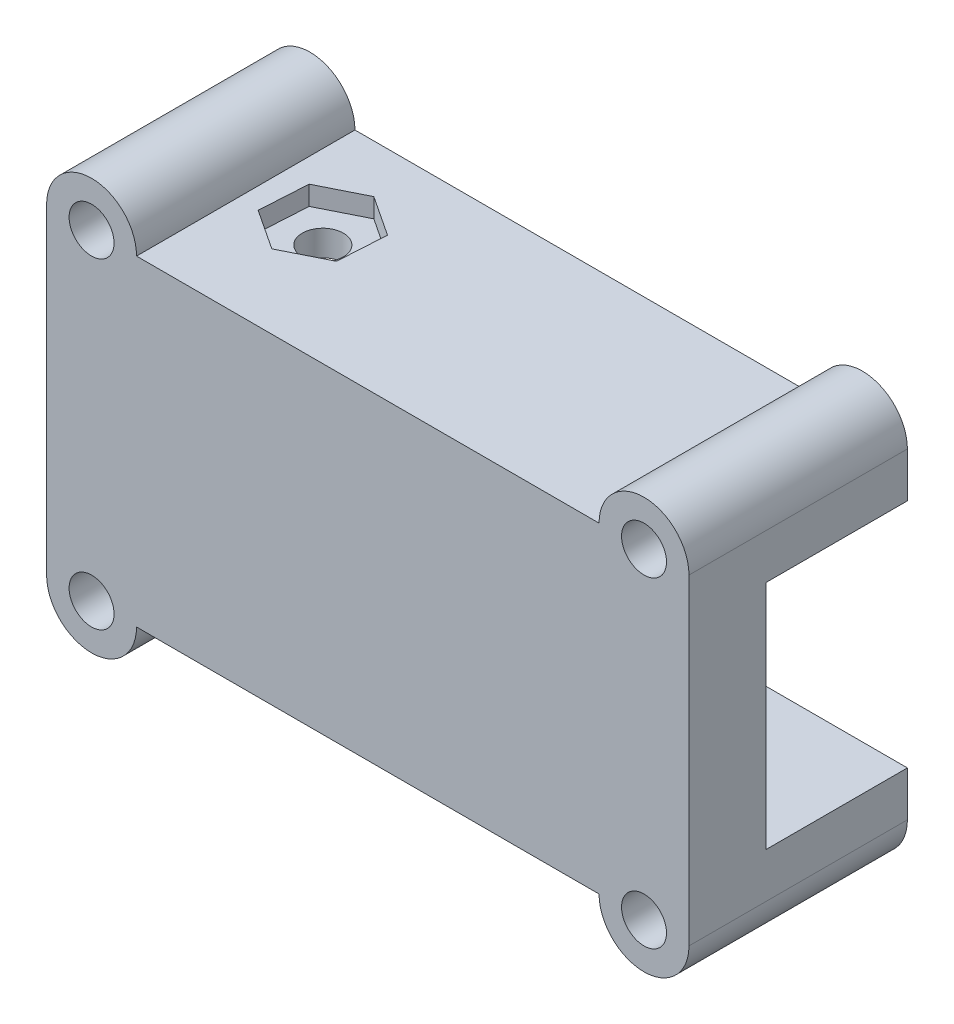
ISO-10303-21;
HEADER;
FILE_DESCRIPTION(('STEP AP214'),'2;1');
FILE_NAME('part.step','',(''),(''),'','','');
FILE_SCHEMA(('AUTOMOTIVE_DESIGN { 1 0 10303 214 1 1 1 1 }'));
ENDSEC;
DATA;
#1=APPLICATION_CONTEXT('core data for automotive mechanical design processes');
#2=APPLICATION_PROTOCOL_DEFINITION('international standard','automotive_design',2000,#1);
#3=PRODUCT_CONTEXT('',#1,'mechanical');
#4=PRODUCT('Part','Part','',(#3));
#5=PRODUCT_RELATED_PRODUCT_CATEGORY('part','',(#4));
#6=PRODUCT_DEFINITION_FORMATION('','',#4);
#7=PRODUCT_DEFINITION_CONTEXT('part definition',#1,'design');
#8=PRODUCT_DEFINITION('design','',#6,#7);
#9=PRODUCT_DEFINITION_SHAPE('','',#8);
#10=(LENGTH_UNIT() NAMED_UNIT(*) SI_UNIT(.MILLI.,.METRE.));
#11=(NAMED_UNIT(*) PLANE_ANGLE_UNIT() SI_UNIT($,.RADIAN.));
#12=(NAMED_UNIT(*) SI_UNIT($,.STERADIAN.) SOLID_ANGLE_UNIT());
#13=UNCERTAINTY_MEASURE_WITH_UNIT(LENGTH_MEASURE(1.E-05),#10,'distance_accuracy_value','');
#14=(GEOMETRIC_REPRESENTATION_CONTEXT(3) GLOBAL_UNCERTAINTY_ASSIGNED_CONTEXT((#13)) GLOBAL_UNIT_ASSIGNED_CONTEXT((#10,
#11,#12)) REPRESENTATION_CONTEXT('',''));
#15=CARTESIAN_POINT('',(0.,0.,0.));
#16=DIRECTION('',(0.,0.,1.));
#17=DIRECTION('',(1.,0.,0.));
#18=AXIS2_PLACEMENT_3D('',#15,#16,#17);
#19=CARTESIAN_POINT('',(-13.,16.,7.5));
#20=DIRECTION('',(0.,-1.,0.));
#21=DIRECTION('',(0.,0.,-1.));
#22=AXIS2_PLACEMENT_3D('',#19,#20,#21);
#23=CYLINDRICAL_SURFACE('',#22,1.6);
#24=CARTESIAN_POINT('',(-13.,9.,7.5));
#25=DIRECTION('',(0.,1.,0.));
#26=DIRECTION('',(-1.,0.,0.));
#27=AXIS2_PLACEMENT_3D('',#24,#25,#26);
#28=CIRCLE('',#27,1.6);
#29=CARTESIAN_POINT('',(-14.6,9.,7.5));
#30=VERTEX_POINT('',#29);
#31=EDGE_CURVE('E232',#30,#30,#28,.T.);
#32=ORIENTED_EDGE('',*,*,#31,.F.);
#33=EDGE_LOOP('',(#32));
#34=FACE_BOUND('',#33,.T.);
#35=CARTESIAN_POINT('',(-13.,11.,7.5));
#36=DIRECTION('',(0.,1.,0.));
#37=DIRECTION('',(0.,0.,1.));
#38=AXIS2_PLACEMENT_3D('',#35,#36,#37);
#39=CIRCLE('',#38,1.6);
#40=CARTESIAN_POINT('',(-13.,11.,9.1));
#41=VERTEX_POINT('',#40);
#42=EDGE_CURVE('E153',#41,#41,#39,.F.);
#43=ORIENTED_EDGE('',*,*,#42,.F.);
#44=EDGE_LOOP('',(#43));
#45=FACE_BOUND('',#44,.T.);
#46=ADVANCED_FACE('F149',(#34,#45),#23,.F.);
#47=CARTESIAN_POINT('',(25.,0.,11.));
#48=DIRECTION('',(-1.,0.,0.));
#49=DIRECTION('',(0.,-1.,0.));
#50=AXIS2_PLACEMENT_3D('',#47,#48,#49);
#51=PLANE('',#50);
#52=DIRECTION('',(0.,1.,0.));
#53=VECTOR('',#52,1.);
#54=CARTESIAN_POINT('',(25.,0.,0.));
#55=LINE('',#54,#53);
#56=CARTESIAN_POINT('',(25.,9.,0.));
#57=VERTEX_POINT('',#56);
#58=CARTESIAN_POINT('',(25.,12.5,0.));
#59=VERTEX_POINT('',#58);
#60=EDGE_CURVE('E214',#57,#59,#55,.T.);
#61=ORIENTED_EDGE('',*,*,#60,.T.);
#62=DIRECTION('',(0.,0.,-1.));
#63=VECTOR('',#62,1.);
#64=CARTESIAN_POINT('',(25.,12.5,11.));
#65=LINE('',#64,#63);
#66=CARTESIAN_POINT('',(25.,12.5,17.));
#67=VERTEX_POINT('',#66);
#68=EDGE_CURVE('E12',#67,#59,#65,.T.);
#69=ORIENTED_EDGE('',*,*,#68,.F.);
#70=DIRECTION('',(0.,-1.,0.));
#71=VECTOR('',#70,1.);
#72=CARTESIAN_POINT('',(25.,0.,17.));
#73=LINE('',#72,#71);
#74=CARTESIAN_POINT('',(25.,-12.5,17.));
#75=VERTEX_POINT('',#74);
#76=EDGE_CURVE('E319',#67,#75,#73,.T.);
#77=ORIENTED_EDGE('',*,*,#76,.T.);
#78=DIRECTION('',(0.,0.,-1.));
#79=VECTOR('',#78,1.);
#80=CARTESIAN_POINT('',(25.,-12.5,17.));
#81=LINE('',#80,#79);
#82=CARTESIAN_POINT('',(25.,-12.5,0.));
#83=VERTEX_POINT('',#82);
#84=EDGE_CURVE('E333',#75,#83,#81,.T.);
#85=ORIENTED_EDGE('',*,*,#84,.T.);
#86=DIRECTION('',(0.,1.,0.));
#87=VECTOR('',#86,1.);
#88=CARTESIAN_POINT('',(25.,0.,0.));
#89=LINE('',#88,#87);
#90=CARTESIAN_POINT('',(25.,-9.00000000000001,0.));
#91=VERTEX_POINT('',#90);
#92=EDGE_CURVE('E277',#83,#91,#89,.T.);
#93=ORIENTED_EDGE('',*,*,#92,.T.);
#94=DIRECTION('',(0.,0.,-1.));
#95=VECTOR('',#94,1.);
#96=CARTESIAN_POINT('',(25.,-9.00000000000001,11.));
#97=LINE('',#96,#95);
#98=CARTESIAN_POINT('',(25.,-9.00000000000001,11.));
#99=VERTEX_POINT('',#98);
#100=EDGE_CURVE('E284',#99,#91,#97,.T.);
#101=ORIENTED_EDGE('',*,*,#100,.F.);
#102=DIRECTION('',(0.,-1.,0.));
#103=VECTOR('',#102,1.);
#104=CARTESIAN_POINT('',(25.,0.,11.));
#105=LINE('',#104,#103);
#106=CARTESIAN_POINT('',(25.,9.,11.));
#107=VERTEX_POINT('',#106);
#108=EDGE_CURVE('E304',#107,#99,#105,.T.);
#109=ORIENTED_EDGE('',*,*,#108,.F.);
#110=DIRECTION('',(0.,0.,-1.));
#111=VECTOR('',#110,1.);
#112=CARTESIAN_POINT('',(25.,9.,11.));
#113=LINE('',#112,#111);
#114=EDGE_CURVE('E205',#107,#57,#113,.T.);
#115=ORIENTED_EDGE('',*,*,#114,.T.);
#116=EDGE_LOOP('',(#61,#69,#77,#85,#93,#101,#109,#115));
#117=FACE_BOUND('',#116,.T.);
#118=ADVANCED_FACE('F366',(#117),#51,.F.);
#119=CARTESIAN_POINT('',(21.5,12.5,11.));
#120=DIRECTION('',(0.,0.,-1.));
#121=DIRECTION('',(-1.,0.,0.));
#122=AXIS2_PLACEMENT_3D('',#119,#120,#121);
#123=CYLINDRICAL_SURFACE('',#122,3.49999999999999);
#124=CARTESIAN_POINT('',(21.5,12.5,0.));
#125=DIRECTION('',(0.,0.,1.));
#126=DIRECTION('',(1.,0.,0.));
#127=AXIS2_PLACEMENT_3D('',#124,#125,#126);
#128=CIRCLE('',#127,3.49999999999999);
#129=CARTESIAN_POINT('',(18.,12.5,0.));
#130=VERTEX_POINT('',#129);
#131=EDGE_CURVE('E348',#59,#130,#128,.T.);
#132=ORIENTED_EDGE('',*,*,#131,.T.);
#133=DIRECTION('',(0.,0.,-1.));
#134=VECTOR('',#133,1.);
#135=CARTESIAN_POINT('',(18.,12.5,11.));
#136=LINE('',#135,#134);
#137=CARTESIAN_POINT('',(18.,12.5,17.));
#138=VERTEX_POINT('',#137);
#139=EDGE_CURVE('E158',#138,#130,#136,.T.);
#140=ORIENTED_EDGE('',*,*,#139,.F.);
#141=CARTESIAN_POINT('',(21.5,12.5,17.));
#142=DIRECTION('',(0.,0.,1.));
#143=DIRECTION('',(1.,0.,0.));
#144=AXIS2_PLACEMENT_3D('',#141,#142,#143);
#145=CIRCLE('',#144,3.49999999999999);
#146=EDGE_CURVE('E316',#67,#138,#145,.T.);
#147=ORIENTED_EDGE('',*,*,#146,.F.);
#148=ORIENTED_EDGE('',*,*,#68,.T.);
#149=EDGE_LOOP('',(#132,#140,#147,#148));
#150=FACE_BOUND('',#149,.T.);
#151=ADVANCED_FACE('F361',(#150),#123,.T.);
#152=CARTESIAN_POINT('',(0.,12.5,11.));
#153=DIRECTION('',(0.,1.,0.));
#154=DIRECTION('',(0.,0.,1.));
#155=AXIS2_PLACEMENT_3D('',#152,#153,#154);
#156=PLANE('',#155);
#157=DIRECTION('',(0.89437298181716,0.,-0.447321997441979));
#158=VECTOR('',#157,1.);
#159=CARTESIAN_POINT('',(-13.2243945741898,12.5,11.2460619867279));
#160=LINE('',#159,#158);
#161=CARTESIAN_POINT('',(-13.2243945741898,12.5,11.2460619867279));
#162=VERTEX_POINT('',#161);
#163=CARTESIAN_POINT('',(-9.86801244243735,12.5,9.56736239508368));
#164=VERTEX_POINT('',#163);
#165=EDGE_CURVE('E166',#162,#164,#160,.T.);
#166=ORIENTED_EDGE('',*,*,#165,.F.);
#167=DIRECTION('',(0.834578704364931,0.,0.55088872399111));
#168=VECTOR('',#167,1.);
#169=CARTESIAN_POINT('',(-16.3563821317524,12.5,9.17869959164419));
#170=LINE('',#169,#168);
#171=CARTESIAN_POINT('',(-16.3563821317524,12.5,9.17869959164419));
#172=VERTEX_POINT('',#171);
#173=EDGE_CURVE('E785',#172,#162,#170,.T.);
#174=ORIENTED_EDGE('',*,*,#173,.F.);
#175=DIRECTION('',(-0.0597942774522284,0.,0.998210721433088));
#176=VECTOR('',#175,1.);
#177=CARTESIAN_POINT('',(-16.1319875575627,12.5,5.43263760491632));
#178=LINE('',#177,#176);
#179=CARTESIAN_POINT('',(-16.1319875575627,12.5,5.43263760491632));
#180=VERTEX_POINT('',#179);
#181=EDGE_CURVE('E779',#180,#172,#178,.T.);
#182=ORIENTED_EDGE('',*,*,#181,.F.);
#183=DIRECTION('',(-0.89437298181716,0.,0.447321997441979));
#184=VECTOR('',#183,1.);
#185=CARTESIAN_POINT('',(-12.7756054258102,12.5,3.75393801327213));
#186=LINE('',#185,#184);
#187=CARTESIAN_POINT('',(-12.7756054258102,12.5,3.75393801327213));
#188=VERTEX_POINT('',#187);
#189=EDGE_CURVE('E776',#188,#180,#186,.T.);
#190=ORIENTED_EDGE('',*,*,#189,.F.);
#191=DIRECTION('',(-0.834578704364931,0.,-0.55088872399111));
#192=VECTOR('',#191,1.);
#193=CARTESIAN_POINT('',(-9.64361786824757,12.5,5.82130040835581));
#194=LINE('',#193,#192);
#195=CARTESIAN_POINT('',(-9.64361786824757,12.5,5.82130040835581));
#196=VERTEX_POINT('',#195);
#197=EDGE_CURVE('E770',#196,#188,#194,.T.);
#198=ORIENTED_EDGE('',*,*,#197,.F.);
#199=DIRECTION('',(0.0597942774522285,0.,-0.998210721433088));
#200=VECTOR('',#199,1.);
#201=CARTESIAN_POINT('',(-9.86801244243735,12.5,9.56736239508368));
#202=LINE('',#201,#200);
#203=EDGE_CURVE('E761',#164,#196,#202,.T.);
#204=ORIENTED_EDGE('',*,*,#203,.F.);
#205=EDGE_LOOP('',(#166,#174,#182,#190,#198,#204));
#206=FACE_BOUND('',#205,.T.);
#207=DIRECTION('',(1.,0.,0.));
#208=VECTOR('',#207,1.);
#209=CARTESIAN_POINT('',(0.,12.5,0.));
#210=LINE('',#209,#208);
#211=CARTESIAN_POINT('',(-18.,12.5,0.));
#212=VERTEX_POINT('',#211);
#213=EDGE_CURVE('E222',#212,#130,#210,.T.);
#214=ORIENTED_EDGE('',*,*,#213,.F.);
#215=DIRECTION('',(0.,0.,-1.));
#216=VECTOR('',#215,1.);
#217=CARTESIAN_POINT('',(-18.,12.5,11.));
#218=LINE('',#217,#216);
#219=CARTESIAN_POINT('',(-18.,12.5,17.));
#220=VERTEX_POINT('',#219);
#221=EDGE_CURVE('E228',#220,#212,#218,.T.);
#222=ORIENTED_EDGE('',*,*,#221,.F.);
#223=DIRECTION('',(-1.,0.,0.));
#224=VECTOR('',#223,1.);
#225=CARTESIAN_POINT('',(0.,12.5,17.));
#226=LINE('',#225,#224);
#227=EDGE_CURVE('E313',#138,#220,#226,.T.);
#228=ORIENTED_EDGE('',*,*,#227,.F.);
#229=ORIENTED_EDGE('',*,*,#139,.T.);
#230=EDGE_LOOP('',(#214,#222,#228,#229));
#231=FACE_BOUND('',#230,.T.);
#232=ADVANCED_FACE('F354',(#206,#231),#156,.T.);
#233=CARTESIAN_POINT('',(-21.5,12.5,11.));
#234=DIRECTION('',(0.,0.,-1.));
#235=DIRECTION('',(-1.,0.,0.));
#236=AXIS2_PLACEMENT_3D('',#233,#234,#235);
#237=CYLINDRICAL_SURFACE('',#236,3.5);
#238=CARTESIAN_POINT('',(-21.5,12.5,0.));
#239=DIRECTION('',(0.,0.,1.));
#240=DIRECTION('',(1.,0.,0.));
#241=AXIS2_PLACEMENT_3D('',#238,#239,#240);
#242=CIRCLE('',#241,3.5);
#243=CARTESIAN_POINT('',(-25.,12.5,0.));
#244=VERTEX_POINT('',#243);
#245=EDGE_CURVE('E220',#212,#244,#242,.T.);
#246=ORIENTED_EDGE('',*,*,#245,.T.);
#247=DIRECTION('',(0.,0.,-1.));
#248=VECTOR('',#247,1.);
#249=CARTESIAN_POINT('',(-25.,12.5,11.));
#250=LINE('',#249,#248);
#251=CARTESIAN_POINT('',(-25.,12.5,17.));
#252=VERTEX_POINT('',#251);
#253=EDGE_CURVE('E204',#252,#244,#250,.T.);
#254=ORIENTED_EDGE('',*,*,#253,.F.);
#255=CARTESIAN_POINT('',(-21.5,12.5,17.));
#256=DIRECTION('',(0.,0.,1.));
#257=DIRECTION('',(1.,0.,0.));
#258=AXIS2_PLACEMENT_3D('',#255,#256,#257);
#259=CIRCLE('',#258,3.5);
#260=EDGE_CURVE('E310',#220,#252,#259,.T.);
#261=ORIENTED_EDGE('',*,*,#260,.F.);
#262=ORIENTED_EDGE('',*,*,#221,.T.);
#263=EDGE_LOOP('',(#246,#254,#261,#262));
#264=FACE_BOUND('',#263,.T.);
#265=ADVANCED_FACE('F430',(#264),#237,.T.);
#266=CARTESIAN_POINT('',(-25.,0.,11.));
#267=DIRECTION('',(-1.,0.,0.));
#268=DIRECTION('',(0.,0.,1.));
#269=AXIS2_PLACEMENT_3D('',#266,#267,#268);
#270=PLANE('',#269);
#271=DIRECTION('',(0.,1.,0.));
#272=VECTOR('',#271,1.);
#273=CARTESIAN_POINT('',(-25.,0.,0.));
#274=LINE('',#273,#272);
#275=CARTESIAN_POINT('',(-25.,9.,0.));
#276=VERTEX_POINT('',#275);
#277=EDGE_CURVE('E212',#276,#244,#274,.T.);
#278=ORIENTED_EDGE('',*,*,#277,.F.);
#279=DIRECTION('',(0.,0.,-1.));
#280=VECTOR('',#279,1.);
#281=CARTESIAN_POINT('',(-25.,9.,11.));
#282=LINE('',#281,#280);
#283=CARTESIAN_POINT('',(-25.,9.,11.));
#284=VERTEX_POINT('',#283);
#285=EDGE_CURVE('E175',#284,#276,#282,.T.);
#286=ORIENTED_EDGE('',*,*,#285,.F.);
#287=DIRECTION('',(0.,-1.,0.));
#288=VECTOR('',#287,1.);
#289=CARTESIAN_POINT('',(-25.,0.,11.));
#290=LINE('',#289,#288);
#291=CARTESIAN_POINT('',(-25.,-9.00000000000001,11.));
#292=VERTEX_POINT('',#291);
#293=EDGE_CURVE('E299',#284,#292,#290,.T.);
#294=ORIENTED_EDGE('',*,*,#293,.T.);
#295=DIRECTION('',(0.,0.,-1.));
#296=VECTOR('',#295,1.);
#297=CARTESIAN_POINT('',(-25.,-9.00000000000001,11.));
#298=LINE('',#297,#296);
#299=CARTESIAN_POINT('',(-25.,-9.00000000000001,0.));
#300=VERTEX_POINT('',#299);
#301=EDGE_CURVE('E258',#292,#300,#298,.T.);
#302=ORIENTED_EDGE('',*,*,#301,.T.);
#303=DIRECTION('',(0.,1.,0.));
#304=VECTOR('',#303,1.);
#305=CARTESIAN_POINT('',(-25.,0.,0.));
#306=LINE('',#305,#304);
#307=CARTESIAN_POINT('',(-25.,-12.5,0.));
#308=VERTEX_POINT('',#307);
#309=EDGE_CURVE('E265',#308,#300,#306,.T.);
#310=ORIENTED_EDGE('',*,*,#309,.F.);
#311=DIRECTION('',(0.,0.,-1.));
#312=VECTOR('',#311,1.);
#313=CARTESIAN_POINT('',(-25.,-12.5,17.));
#314=LINE('',#313,#312);
#315=CARTESIAN_POINT('',(-25.,-12.5,17.));
#316=VERTEX_POINT('',#315);
#317=EDGE_CURVE('E336',#316,#308,#314,.T.);
#318=ORIENTED_EDGE('',*,*,#317,.F.);
#319=DIRECTION('',(0.,-1.,0.));
#320=VECTOR('',#319,1.);
#321=CARTESIAN_POINT('',(-25.,0.,17.));
#322=LINE('',#321,#320);
#323=EDGE_CURVE('E307',#252,#316,#322,.T.);
#324=ORIENTED_EDGE('',*,*,#323,.F.);
#325=ORIENTED_EDGE('',*,*,#253,.T.);
#326=EDGE_LOOP('',(#278,#286,#294,#302,#310,#318,#324,#325));
#327=FACE_BOUND('',#326,.T.);
#328=ADVANCED_FACE('F216',(#327),#270,.T.);
#329=CARTESIAN_POINT('',(21.5,12.5,11.));
#330=DIRECTION('',(0.,0.,-1.));
#331=DIRECTION('',(-1.,0.,0.));
#332=AXIS2_PLACEMENT_3D('',#329,#330,#331);
#333=CYLINDRICAL_SURFACE('',#332,1.75);
#334=CARTESIAN_POINT('',(21.5,12.5,0.));
#335=DIRECTION('',(0.,0.,1.));
#336=DIRECTION('',(1.,0.,0.));
#337=AXIS2_PLACEMENT_3D('',#334,#335,#336);
#338=CIRCLE('',#337,1.75);
#339=CARTESIAN_POINT('',(23.25,12.5,0.));
#340=VERTEX_POINT('',#339);
#341=EDGE_CURVE('E344',#340,#340,#338,.T.);
#342=ORIENTED_EDGE('',*,*,#341,.F.);
#343=EDGE_LOOP('',(#342));
#344=FACE_BOUND('',#343,.T.);
#345=CARTESIAN_POINT('',(21.5,12.5,17.));
#346=DIRECTION('',(0.,0.,1.));
#347=DIRECTION('',(1.,0.,0.));
#348=AXIS2_PLACEMENT_3D('',#345,#346,#347);
#349=CIRCLE('',#348,1.75);
#350=CARTESIAN_POINT('',(23.25,12.5,17.));
#351=VERTEX_POINT('',#350);
#352=EDGE_CURVE('E287',#351,#351,#349,.T.);
#353=ORIENTED_EDGE('',*,*,#352,.T.);
#354=EDGE_LOOP('',(#353));
#355=FACE_BOUND('',#354,.T.);
#356=ADVANCED_FACE('F437',(#344,#355),#333,.F.);
#357=CARTESIAN_POINT('',(-21.5,12.5,11.));
#358=DIRECTION('',(0.,0.,-1.));
#359=DIRECTION('',(-1.,0.,0.));
#360=AXIS2_PLACEMENT_3D('',#357,#358,#359);
#361=CYLINDRICAL_SURFACE('',#360,1.75);
#362=CARTESIAN_POINT('',(-21.5,12.5,0.));
#363=DIRECTION('',(0.,0.,1.));
#364=DIRECTION('',(1.,0.,0.));
#365=AXIS2_PLACEMENT_3D('',#362,#363,#364);
#366=CIRCLE('',#365,1.75);
#367=CARTESIAN_POINT('',(-19.75,12.5,0.));
#368=VERTEX_POINT('',#367);
#369=EDGE_CURVE('E332',#368,#368,#366,.T.);
#370=ORIENTED_EDGE('',*,*,#369,.F.);
#371=EDGE_LOOP('',(#370));
#372=FACE_BOUND('',#371,.T.);
#373=CARTESIAN_POINT('',(-21.5,12.5,17.));
#374=DIRECTION('',(0.,0.,1.));
#375=DIRECTION('',(1.,0.,0.));
#376=AXIS2_PLACEMENT_3D('',#373,#374,#375);
#377=CIRCLE('',#376,1.75);
#378=CARTESIAN_POINT('',(-19.75,12.5,17.));
#379=VERTEX_POINT('',#378);
#380=EDGE_CURVE('E296',#379,#379,#377,.T.);
#381=ORIENTED_EDGE('',*,*,#380,.T.);
#382=EDGE_LOOP('',(#381));
#383=FACE_BOUND('',#382,.T.);
#384=ADVANCED_FACE('F151',(#372,#383),#361,.F.);
#385=CARTESIAN_POINT('',(0.,9.,11.));
#386=DIRECTION('',(0.,1.,0.));
#387=DIRECTION('',(-1.,0.,0.));
#388=AXIS2_PLACEMENT_3D('',#385,#386,#387);
#389=PLANE('',#388);
#390=ORIENTED_EDGE('',*,*,#31,.T.);
#391=EDGE_LOOP('',(#390));
#392=FACE_BOUND('',#391,.T.);
#393=DIRECTION('',(1.,0.,0.));
#394=VECTOR('',#393,1.);
#395=CARTESIAN_POINT('',(0.,9.,0.));
#396=LINE('',#395,#394);
#397=EDGE_CURVE('E199',#276,#57,#396,.T.);
#398=ORIENTED_EDGE('',*,*,#397,.T.);
#399=ORIENTED_EDGE('',*,*,#114,.F.);
#400=DIRECTION('',(1.,0.,0.));
#401=VECTOR('',#400,1.);
#402=CARTESIAN_POINT('',(0.,9.,11.));
#403=LINE('',#402,#401);
#404=EDGE_CURVE('E202',#284,#107,#403,.T.);
#405=ORIENTED_EDGE('',*,*,#404,.F.);
#406=ORIENTED_EDGE('',*,*,#285,.T.);
#407=EDGE_LOOP('',(#398,#399,#405,#406));
#408=FACE_BOUND('',#407,.T.);
#409=ADVANCED_FACE('F197',(#392,#408),#389,.F.);
#410=CARTESIAN_POINT('',(0.,0.,0.));
#411=DIRECTION('',(0.,0.,1.));
#412=DIRECTION('',(1.,0.,0.));
#413=AXIS2_PLACEMENT_3D('',#410,#411,#412);
#414=PLANE('',#413);
#415=ORIENTED_EDGE('',*,*,#369,.T.);
#416=EDGE_LOOP('',(#415));
#417=FACE_BOUND('',#416,.T.);
#418=ORIENTED_EDGE('',*,*,#341,.T.);
#419=EDGE_LOOP('',(#418));
#420=FACE_BOUND('',#419,.T.);
#421=ORIENTED_EDGE('',*,*,#60,.F.);
#422=ORIENTED_EDGE('',*,*,#397,.F.);
#423=ORIENTED_EDGE('',*,*,#277,.T.);
#424=ORIENTED_EDGE('',*,*,#245,.F.);
#425=ORIENTED_EDGE('',*,*,#213,.T.);
#426=ORIENTED_EDGE('',*,*,#131,.F.);
#427=EDGE_LOOP('',(#421,#422,#423,#424,#425,#426));
#428=FACE_BOUND('',#427,.T.);
#429=ADVANCED_FACE('F210',(#417,#420,#428),#414,.F.);
#430=CARTESIAN_POINT('',(-21.5,-12.5,11.));
#431=DIRECTION('',(0.,0.,1.));
#432=DIRECTION('',(1.,0.,0.));
#433=AXIS2_PLACEMENT_3D('',#430,#431,#432);
#434=PLANE('',#433);
#435=CARTESIAN_POINT('',(15.,0.,11.));
#436=DIRECTION('',(0.,0.,-1.));
#437=DIRECTION('',(-1.,0.,0.));
#438=AXIS2_PLACEMENT_3D('',#435,#436,#437);
#439=CIRCLE('',#438,4.25);
#440=CARTESIAN_POINT('',(10.75,0.,11.));
#441=VERTEX_POINT('',#440);
#442=EDGE_CURVE('E237',#441,#441,#439,.T.);
#443=ORIENTED_EDGE('',*,*,#442,.F.);
#444=EDGE_LOOP('',(#443));
#445=FACE_BOUND('',#444,.T.);
#446=ORIENTED_EDGE('',*,*,#108,.T.);
#447=DIRECTION('',(1.,0.,0.));
#448=VECTOR('',#447,1.);
#449=CARTESIAN_POINT('',(0.,-9.00000000000001,11.));
#450=LINE('',#449,#448);
#451=EDGE_CURVE('E255',#292,#99,#450,.T.);
#452=ORIENTED_EDGE('',*,*,#451,.F.);
#453=ORIENTED_EDGE('',*,*,#293,.F.);
#454=ORIENTED_EDGE('',*,*,#404,.T.);
#455=EDGE_LOOP('',(#446,#452,#453,#454));
#456=FACE_BOUND('',#455,.T.);
#457=ADVANCED_FACE('F371',(#445,#456),#434,.F.);
#458=CARTESIAN_POINT('',(-21.5,-12.5,17.));
#459=DIRECTION('',(0.,0.,1.));
#460=DIRECTION('',(1.,0.,0.));
#461=AXIS2_PLACEMENT_3D('',#458,#459,#460);
#462=PLANE('',#461);
#463=CARTESIAN_POINT('',(21.5,-12.5,17.));
#464=DIRECTION('',(0.,0.,1.));
#465=DIRECTION('',(1.,0.,0.));
#466=AXIS2_PLACEMENT_3D('',#463,#464,#465);
#467=CIRCLE('',#466,1.75);
#468=CARTESIAN_POINT('',(23.25,-12.5,17.));
#469=VERTEX_POINT('',#468);
#470=EDGE_CURVE('E290',#469,#469,#467,.T.);
#471=ORIENTED_EDGE('',*,*,#470,.F.);
#472=EDGE_LOOP('',(#471));
#473=FACE_BOUND('',#472,.T.);
#474=ORIENTED_EDGE('',*,*,#380,.F.);
#475=EDGE_LOOP('',(#474));
#476=FACE_BOUND('',#475,.T.);
#477=DIRECTION('',(-1.,0.,0.));
#478=VECTOR('',#477,1.);
#479=CARTESIAN_POINT('',(0.,-12.5,17.));
#480=LINE('',#479,#478);
#481=CARTESIAN_POINT('',(18.,-12.5,17.));
#482=VERTEX_POINT('',#481);
#483=CARTESIAN_POINT('',(-18.,-12.5,17.));
#484=VERTEX_POINT('',#483);
#485=EDGE_CURVE('E300',#482,#484,#480,.T.);
#486=ORIENTED_EDGE('',*,*,#485,.F.);
#487=CARTESIAN_POINT('',(21.5,-12.5,17.));
#488=DIRECTION('',(0.,0.,1.));
#489=DIRECTION('',(1.,0.,0.));
#490=AXIS2_PLACEMENT_3D('',#487,#488,#489);
#491=CIRCLE('',#490,3.5);
#492=EDGE_CURVE('E322',#482,#75,#491,.T.);
#493=ORIENTED_EDGE('',*,*,#492,.T.);
#494=ORIENTED_EDGE('',*,*,#76,.F.);
#495=ORIENTED_EDGE('',*,*,#146,.T.);
#496=ORIENTED_EDGE('',*,*,#227,.T.);
#497=ORIENTED_EDGE('',*,*,#260,.T.);
#498=ORIENTED_EDGE('',*,*,#323,.T.);
#499=CARTESIAN_POINT('',(-21.5,-12.5,17.));
#500=DIRECTION('',(0.,0.,1.));
#501=DIRECTION('',(1.,0.,0.));
#502=AXIS2_PLACEMENT_3D('',#499,#500,#501);
#503=CIRCLE('',#502,3.5);
#504=EDGE_CURVE('E303',#316,#484,#503,.T.);
#505=ORIENTED_EDGE('',*,*,#504,.T.);
#506=EDGE_LOOP('',(#486,#493,#494,#495,#496,#497,#498,#505));
#507=FACE_BOUND('',#506,.T.);
#508=CARTESIAN_POINT('',(-21.5,-12.5,17.));
#509=DIRECTION('',(0.,0.,1.));
#510=DIRECTION('',(1.,0.,0.));
#511=AXIS2_PLACEMENT_3D('',#508,#509,#510);
#512=CIRCLE('',#511,1.75);
#513=CARTESIAN_POINT('',(-19.75,-12.5,17.));
#514=VERTEX_POINT('',#513);
#515=EDGE_CURVE('E293',#514,#514,#512,.T.);
#516=ORIENTED_EDGE('',*,*,#515,.F.);
#517=EDGE_LOOP('',(#516));
#518=FACE_BOUND('',#517,.T.);
#519=ORIENTED_EDGE('',*,*,#352,.F.);
#520=EDGE_LOOP('',(#519));
#521=FACE_BOUND('',#520,.T.);
#522=ADVANCED_FACE('F417',(#473,#476,#507,#518,#521),#462,.T.);
#523=CARTESIAN_POINT('',(0.,-12.5,17.));
#524=DIRECTION('',(0.,-1.,0.));
#525=DIRECTION('',(0.,0.,-1.));
#526=AXIS2_PLACEMENT_3D('',#523,#524,#525);
#527=PLANE('',#526);
#528=CARTESIAN_POINT('',(-13.,-12.5,7.5));
#529=DIRECTION('',(0.,-1.,0.));
#530=DIRECTION('',(0.,0.,-1.));
#531=AXIS2_PLACEMENT_3D('',#528,#529,#530);
#532=CIRCLE('',#531,1.6);
#533=CARTESIAN_POINT('',(-13.,-12.5,5.9));
#534=VERTEX_POINT('',#533);
#535=EDGE_CURVE('E233',#534,#534,#532,.T.);
#536=ORIENTED_EDGE('',*,*,#535,.F.);
#537=EDGE_LOOP('',(#536));
#538=FACE_BOUND('',#537,.T.);
#539=DIRECTION('',(0.,0.,-1.));
#540=VECTOR('',#539,1.);
#541=CARTESIAN_POINT('',(-18.,-12.5,17.));
#542=LINE('',#541,#540);
#543=CARTESIAN_POINT('',(-18.,-12.5,0.));
#544=VERTEX_POINT('',#543);
#545=EDGE_CURVE('E325',#484,#544,#542,.T.);
#546=ORIENTED_EDGE('',*,*,#545,.T.);
#547=DIRECTION('',(1.,0.,0.));
#548=VECTOR('',#547,1.);
#549=CARTESIAN_POINT('',(0.,-12.5,0.));
#550=LINE('',#549,#548);
#551=CARTESIAN_POINT('',(18.,-12.5,0.));
#552=VERTEX_POINT('',#551);
#553=EDGE_CURVE('E271',#544,#552,#550,.T.);
#554=ORIENTED_EDGE('',*,*,#553,.T.);
#555=DIRECTION('',(0.,0.,-1.));
#556=VECTOR('',#555,1.);
#557=CARTESIAN_POINT('',(18.,-12.5,17.));
#558=LINE('',#557,#556);
#559=EDGE_CURVE('E329',#482,#552,#558,.T.);
#560=ORIENTED_EDGE('',*,*,#559,.F.);
#561=ORIENTED_EDGE('',*,*,#485,.T.);
#562=EDGE_LOOP('',(#546,#554,#560,#561));
#563=FACE_BOUND('',#562,.T.);
#564=ADVANCED_FACE('F409',(#538,#563),#527,.T.);
#565=CARTESIAN_POINT('',(21.5,-12.5,17.));
#566=DIRECTION('',(0.,0.,-1.));
#567=DIRECTION('',(-1.,0.,0.));
#568=AXIS2_PLACEMENT_3D('',#565,#566,#567);
#569=CYLINDRICAL_SURFACE('',#568,3.5);
#570=ORIENTED_EDGE('',*,*,#559,.T.);
#571=CARTESIAN_POINT('',(21.5,-12.5,0.));
#572=DIRECTION('',(0.,0.,1.));
#573=DIRECTION('',(1.,0.,0.));
#574=AXIS2_PLACEMENT_3D('',#571,#572,#573);
#575=CIRCLE('',#574,3.5);
#576=EDGE_CURVE('E274',#552,#83,#575,.T.);
#577=ORIENTED_EDGE('',*,*,#576,.T.);
#578=ORIENTED_EDGE('',*,*,#84,.F.);
#579=ORIENTED_EDGE('',*,*,#492,.F.);
#580=EDGE_LOOP('',(#570,#577,#578,#579));
#581=FACE_BOUND('',#580,.T.);
#582=ADVANCED_FACE('F415',(#581),#569,.T.);
#583=CARTESIAN_POINT('',(-21.5,-12.5,17.));
#584=DIRECTION('',(0.,0.,-1.));
#585=DIRECTION('',(-1.,0.,0.));
#586=AXIS2_PLACEMENT_3D('',#583,#584,#585);
#587=CYLINDRICAL_SURFACE('',#586,3.5);
#588=ORIENTED_EDGE('',*,*,#317,.T.);
#589=CARTESIAN_POINT('',(-21.5,-12.5,0.));
#590=DIRECTION('',(0.,0.,1.));
#591=DIRECTION('',(1.,0.,0.));
#592=AXIS2_PLACEMENT_3D('',#589,#590,#591);
#593=CIRCLE('',#592,3.5);
#594=EDGE_CURVE('E268',#308,#544,#593,.T.);
#595=ORIENTED_EDGE('',*,*,#594,.T.);
#596=ORIENTED_EDGE('',*,*,#545,.F.);
#597=ORIENTED_EDGE('',*,*,#504,.F.);
#598=EDGE_LOOP('',(#588,#595,#596,#597));
#599=FACE_BOUND('',#598,.T.);
#600=ADVANCED_FACE('F423',(#599),#587,.T.);
#601=CARTESIAN_POINT('',(-21.5,-12.5,17.));
#602=DIRECTION('',(0.,0.,-1.));
#603=DIRECTION('',(-1.,0.,0.));
#604=AXIS2_PLACEMENT_3D('',#601,#602,#603);
#605=CYLINDRICAL_SURFACE('',#604,1.75);
#606=ORIENTED_EDGE('',*,*,#515,.T.);
#607=EDGE_LOOP('',(#606));
#608=FACE_BOUND('',#607,.T.);
#609=CARTESIAN_POINT('',(-21.5,-12.5,0.));
#610=DIRECTION('',(0.,0.,1.));
#611=DIRECTION('',(1.,0.,0.));
#612=AXIS2_PLACEMENT_3D('',#609,#610,#611);
#613=CIRCLE('',#612,1.75);
#614=CARTESIAN_POINT('',(-19.75,-12.5,0.));
#615=VERTEX_POINT('',#614);
#616=EDGE_CURVE('E262',#615,#615,#613,.T.);
#617=ORIENTED_EDGE('',*,*,#616,.F.);
#618=EDGE_LOOP('',(#617));
#619=FACE_BOUND('',#618,.T.);
#620=ADVANCED_FACE('F483',(#608,#619),#605,.F.);
#621=CARTESIAN_POINT('',(21.5,-12.5,17.));
#622=DIRECTION('',(0.,0.,-1.));
#623=DIRECTION('',(-1.,0.,0.));
#624=AXIS2_PLACEMENT_3D('',#621,#622,#623);
#625=CYLINDRICAL_SURFACE('',#624,1.75);
#626=ORIENTED_EDGE('',*,*,#470,.T.);
#627=EDGE_LOOP('',(#626));
#628=FACE_BOUND('',#627,.T.);
#629=CARTESIAN_POINT('',(21.5,-12.5,0.));
#630=DIRECTION('',(0.,0.,1.));
#631=DIRECTION('',(1.,0.,0.));
#632=AXIS2_PLACEMENT_3D('',#629,#630,#631);
#633=CIRCLE('',#632,1.75);
#634=CARTESIAN_POINT('',(23.25,-12.5,0.));
#635=VERTEX_POINT('',#634);
#636=EDGE_CURVE('E252',#635,#635,#633,.T.);
#637=ORIENTED_EDGE('',*,*,#636,.F.);
#638=EDGE_LOOP('',(#637));
#639=FACE_BOUND('',#638,.T.);
#640=ADVANCED_FACE('F479',(#628,#639),#625,.F.);
#641=CARTESIAN_POINT('',(0.,-9.00000000000001,11.));
#642=DIRECTION('',(0.,1.,0.));
#643=DIRECTION('',(-1.,0.,0.));
#644=AXIS2_PLACEMENT_3D('',#641,#642,#643);
#645=PLANE('',#644);
#646=CARTESIAN_POINT('',(-13.,-9.00000000000001,7.5));
#647=DIRECTION('',(0.,1.,0.));
#648=DIRECTION('',(-1.,0.,0.));
#649=AXIS2_PLACEMENT_3D('',#646,#647,#648);
#650=CIRCLE('',#649,1.6);
#651=CARTESIAN_POINT('',(-14.6,-9.00000000000001,7.5));
#652=VERTEX_POINT('',#651);
#653=EDGE_CURVE('E230',#652,#652,#650,.T.);
#654=ORIENTED_EDGE('',*,*,#653,.F.);
#655=EDGE_LOOP('',(#654));
#656=FACE_BOUND('',#655,.T.);
#657=DIRECTION('',(1.,0.,0.));
#658=VECTOR('',#657,1.);
#659=CARTESIAN_POINT('',(0.,-9.00000000000001,0.));
#660=LINE('',#659,#658);
#661=EDGE_CURVE('E259',#300,#91,#660,.T.);
#662=ORIENTED_EDGE('',*,*,#661,.F.);
#663=ORIENTED_EDGE('',*,*,#301,.F.);
#664=ORIENTED_EDGE('',*,*,#451,.T.);
#665=ORIENTED_EDGE('',*,*,#100,.T.);
#666=EDGE_LOOP('',(#662,#663,#664,#665));
#667=FACE_BOUND('',#666,.T.);
#668=ADVANCED_FACE('F476',(#656,#667),#645,.T.);
#669=CARTESIAN_POINT('',(0.,0.,0.));
#670=DIRECTION('',(0.,0.,1.));
#671=DIRECTION('',(1.,0.,0.));
#672=AXIS2_PLACEMENT_3D('',#669,#670,#671);
#673=PLANE('',#672);
#674=ORIENTED_EDGE('',*,*,#636,.T.);
#675=EDGE_LOOP('',(#674));
#676=FACE_BOUND('',#675,.T.);
#677=ORIENTED_EDGE('',*,*,#616,.T.);
#678=EDGE_LOOP('',(#677));
#679=FACE_BOUND('',#678,.T.);
#680=ORIENTED_EDGE('',*,*,#309,.T.);
#681=ORIENTED_EDGE('',*,*,#661,.T.);
#682=ORIENTED_EDGE('',*,*,#92,.F.);
#683=ORIENTED_EDGE('',*,*,#576,.F.);
#684=ORIENTED_EDGE('',*,*,#553,.F.);
#685=ORIENTED_EDGE('',*,*,#594,.F.);
#686=EDGE_LOOP('',(#680,#681,#682,#683,#684,#685));
#687=FACE_BOUND('',#686,.T.);
#688=ADVANCED_FACE('F426',(#676,#679,#687),#673,.F.);
#689=CARTESIAN_POINT('',(15.,0.,16.));
#690=DIRECTION('',(0.,0.,-1.));
#691=DIRECTION('',(-1.,0.,0.));
#692=AXIS2_PLACEMENT_3D('',#689,#690,#691);
#693=CYLINDRICAL_SURFACE('',#692,4.25);
#694=CARTESIAN_POINT('',(15.,0.,16.));
#695=DIRECTION('',(0.,0.,-1.));
#696=DIRECTION('',(-1.,0.,0.));
#697=AXIS2_PLACEMENT_3D('',#694,#695,#696);
#698=CIRCLE('',#697,4.25);
#699=CARTESIAN_POINT('',(10.75,0.,16.));
#700=VERTEX_POINT('',#699);
#701=EDGE_CURVE('E249',#700,#700,#698,.T.);
#702=ORIENTED_EDGE('',*,*,#701,.F.);
#703=EDGE_LOOP('',(#702));
#704=FACE_BOUND('',#703,.T.);
#705=ORIENTED_EDGE('',*,*,#442,.T.);
#706=EDGE_LOOP('',(#705));
#707=FACE_BOUND('',#706,.T.);
#708=ADVANCED_FACE('F465',(#704,#707),#693,.F.);
#709=CARTESIAN_POINT('',(15.,0.,16.));
#710=DIRECTION('',(0.,0.,-1.));
#711=DIRECTION('',(-1.,0.,0.));
#712=AXIS2_PLACEMENT_3D('',#709,#710,#711);
#713=PLANE('',#712);
#714=ORIENTED_EDGE('',*,*,#701,.T.);
#715=EDGE_LOOP('',(#714));
#716=FACE_BOUND('',#715,.T.);
#717=ADVANCED_FACE('F456',(#716),#713,.T.);
#718=ORIENTED_EDGE('',*,*,#653,.T.);
#719=EDGE_LOOP('',(#718));
#720=FACE_BOUND('',#719,.T.);
#721=ORIENTED_EDGE('',*,*,#535,.T.);
#722=EDGE_LOOP('',(#721));
#723=FACE_BOUND('',#722,.T.);
#724=ADVANCED_FACE('F445',(#720,#723),#23,.F.);
#725=CARTESIAN_POINT('',(0.,11.,0.));
#726=DIRECTION('',(0.,1.,0.));
#727=DIRECTION('',(0.,0.,1.));
#728=AXIS2_PLACEMENT_3D('',#725,#726,#727);
#729=PLANE('',#728);
#730=DIRECTION('',(0.89437298181716,0.,-0.447321997441979));
#731=VECTOR('',#730,1.);
#732=CARTESIAN_POINT('',(-13.2243945741898,11.,11.2460619867279));
#733=LINE('',#732,#731);
#734=CARTESIAN_POINT('',(-13.2243945741898,11.,11.2460619867279));
#735=VERTEX_POINT('',#734);
#736=CARTESIAN_POINT('',(-9.86801244243735,11.,9.56736239508368));
#737=VERTEX_POINT('',#736);
#738=EDGE_CURVE('E788',#735,#737,#733,.T.);
#739=ORIENTED_EDGE('',*,*,#738,.T.);
#740=DIRECTION('',(0.0597942774522285,0.,-0.998210721433088));
#741=VECTOR('',#740,1.);
#742=CARTESIAN_POINT('',(-9.86801244243735,11.,9.56736239508368));
#743=LINE('',#742,#741);
#744=CARTESIAN_POINT('',(-9.64361786824757,11.,5.82130040835581));
#745=VERTEX_POINT('',#744);
#746=EDGE_CURVE('E813',#737,#745,#743,.T.);
#747=ORIENTED_EDGE('',*,*,#746,.T.);
#748=DIRECTION('',(-0.834578704364931,0.,-0.55088872399111));
#749=VECTOR('',#748,1.);
#750=CARTESIAN_POINT('',(-9.64361786824757,11.,5.82130040835581));
#751=LINE('',#750,#749);
#752=CARTESIAN_POINT('',(-12.7756054258102,11.,3.75393801327213));
#753=VERTEX_POINT('',#752);
#754=EDGE_CURVE('E810',#745,#753,#751,.T.);
#755=ORIENTED_EDGE('',*,*,#754,.T.);
#756=DIRECTION('',(-0.89437298181716,0.,0.447321997441979));
#757=VECTOR('',#756,1.);
#758=CARTESIAN_POINT('',(-12.7756054258102,11.,3.75393801327213));
#759=LINE('',#758,#757);
#760=CARTESIAN_POINT('',(-16.1319875575627,11.,5.43263760491632));
#761=VERTEX_POINT('',#760);
#762=EDGE_CURVE('E805',#753,#761,#759,.T.);
#763=ORIENTED_EDGE('',*,*,#762,.T.);
#764=DIRECTION('',(-0.0597942774522284,0.,0.998210721433088));
#765=VECTOR('',#764,1.);
#766=CARTESIAN_POINT('',(-16.1319875575627,11.,5.43263760491632));
#767=LINE('',#766,#765);
#768=CARTESIAN_POINT('',(-16.3563821317524,11.,9.17869959164419));
#769=VERTEX_POINT('',#768);
#770=EDGE_CURVE('E800',#761,#769,#767,.T.);
#771=ORIENTED_EDGE('',*,*,#770,.T.);
#772=DIRECTION('',(0.834578704364931,0.,0.55088872399111));
#773=VECTOR('',#772,1.);
#774=CARTESIAN_POINT('',(-16.3563821317524,11.,9.17869959164419));
#775=LINE('',#774,#773);
#776=EDGE_CURVE('E798',#769,#735,#775,.T.);
#777=ORIENTED_EDGE('',*,*,#776,.T.);
#778=EDGE_LOOP('',(#739,#747,#755,#763,#771,#777));
#779=FACE_BOUND('',#778,.T.);
#780=ORIENTED_EDGE('',*,*,#42,.T.);
#781=EDGE_LOOP('',(#780));
#782=FACE_BOUND('',#781,.T.);
#783=ADVANCED_FACE('F455',(#779,#782),#729,.T.);
#784=CARTESIAN_POINT('',(-13.2243945741898,11.,11.2460619867279));
#785=DIRECTION('',(0.447321997441979,0.,0.89437298181716));
#786=DIRECTION('',(0.89437298181716,0.,-0.447321997441979));
#787=AXIS2_PLACEMENT_3D('',#784,#785,#786);
#788=PLANE('',#787);
#789=ORIENTED_EDGE('',*,*,#165,.T.);
#790=DIRECTION('',(0.,1.,0.));
#791=VECTOR('',#790,1.);
#792=CARTESIAN_POINT('',(-9.86801244243735,11.,9.56736239508368));
#793=LINE('',#792,#791);
#794=EDGE_CURVE('E246',#737,#164,#793,.T.);
#795=ORIENTED_EDGE('',*,*,#794,.F.);
#796=ORIENTED_EDGE('',*,*,#738,.F.);
#797=DIRECTION('',(0.,1.,0.));
#798=VECTOR('',#797,1.);
#799=CARTESIAN_POINT('',(-13.2243945741898,11.,11.2460619867279));
#800=LINE('',#799,#798);
#801=EDGE_CURVE('E244',#735,#162,#800,.T.);
#802=ORIENTED_EDGE('',*,*,#801,.T.);
#803=EDGE_LOOP('',(#789,#795,#796,#802));
#804=FACE_BOUND('',#803,.T.);
#805=ADVANCED_FACE('F461',(#804),#788,.F.);
#806=CARTESIAN_POINT('',(-16.3563821317524,11.,9.17869959164419));
#807=DIRECTION('',(-0.55088872399111,0.,0.834578704364931));
#808=DIRECTION('',(0.834578704364931,0.,0.55088872399111));
#809=AXIS2_PLACEMENT_3D('',#806,#807,#808);
#810=PLANE('',#809);
#811=ORIENTED_EDGE('',*,*,#173,.T.);
#812=ORIENTED_EDGE('',*,*,#801,.F.);
#813=ORIENTED_EDGE('',*,*,#776,.F.);
#814=DIRECTION('',(0.,1.,0.));
#815=VECTOR('',#814,1.);
#816=CARTESIAN_POINT('',(-16.3563821317524,11.,9.17869959164419));
#817=LINE('',#816,#815);
#818=EDGE_CURVE('E790',#769,#172,#817,.T.);
#819=ORIENTED_EDGE('',*,*,#818,.T.);
#820=EDGE_LOOP('',(#811,#812,#813,#819));
#821=FACE_BOUND('',#820,.T.);
#822=ADVANCED_FACE('F683',(#821),#810,.F.);
#823=CARTESIAN_POINT('',(-16.1319875575627,11.,5.43263760491632));
#824=DIRECTION('',(-0.998210721433088,0.,-0.0597942774522284));
#825=DIRECTION('',(-0.0597942774522284,0.,0.998210721433088));
#826=AXIS2_PLACEMENT_3D('',#823,#824,#825);
#827=PLANE('',#826);
#828=ORIENTED_EDGE('',*,*,#181,.T.);
#829=ORIENTED_EDGE('',*,*,#818,.F.);
#830=ORIENTED_EDGE('',*,*,#770,.F.);
#831=DIRECTION('',(0.,1.,0.));
#832=VECTOR('',#831,1.);
#833=CARTESIAN_POINT('',(-16.1319875575627,11.,5.43263760491632));
#834=LINE('',#833,#832);
#835=EDGE_CURVE('E793',#761,#180,#834,.T.);
#836=ORIENTED_EDGE('',*,*,#835,.T.);
#837=EDGE_LOOP('',(#828,#829,#830,#836));
#838=FACE_BOUND('',#837,.T.);
#839=ADVANCED_FACE('F690',(#838),#827,.F.);
#840=CARTESIAN_POINT('',(-12.7756054258102,11.,3.75393801327213));
#841=DIRECTION('',(-0.447321997441979,0.,-0.89437298181716));
#842=DIRECTION('',(-0.89437298181716,0.,0.447321997441979));
#843=AXIS2_PLACEMENT_3D('',#840,#841,#842);
#844=PLANE('',#843);
#845=ORIENTED_EDGE('',*,*,#189,.T.);
#846=ORIENTED_EDGE('',*,*,#835,.F.);
#847=ORIENTED_EDGE('',*,*,#762,.F.);
#848=DIRECTION('',(0.,1.,0.));
#849=VECTOR('',#848,1.);
#850=CARTESIAN_POINT('',(-12.7756054258102,11.,3.75393801327213));
#851=LINE('',#850,#849);
#852=EDGE_CURVE('E796',#753,#188,#851,.T.);
#853=ORIENTED_EDGE('',*,*,#852,.T.);
#854=EDGE_LOOP('',(#845,#846,#847,#853));
#855=FACE_BOUND('',#854,.T.);
#856=ADVANCED_FACE('F699',(#855),#844,.F.);
#857=CARTESIAN_POINT('',(-9.64361786824757,11.,5.82130040835581));
#858=DIRECTION('',(0.55088872399111,0.,-0.834578704364931));
#859=DIRECTION('',(-0.834578704364931,0.,-0.55088872399111));
#860=AXIS2_PLACEMENT_3D('',#857,#858,#859);
#861=PLANE('',#860);
#862=ORIENTED_EDGE('',*,*,#197,.T.);
#863=ORIENTED_EDGE('',*,*,#852,.F.);
#864=ORIENTED_EDGE('',*,*,#754,.F.);
#865=DIRECTION('',(0.,1.,0.));
#866=VECTOR('',#865,1.);
#867=CARTESIAN_POINT('',(-9.64361786824757,11.,5.82130040835581));
#868=LINE('',#867,#866);
#869=EDGE_CURVE('E766',#745,#196,#868,.T.);
#870=ORIENTED_EDGE('',*,*,#869,.T.);
#871=EDGE_LOOP('',(#862,#863,#864,#870));
#872=FACE_BOUND('',#871,.T.);
#873=ADVANCED_FACE('F708',(#872),#861,.F.);
#874=CARTESIAN_POINT('',(-9.86801244243735,11.,9.56736239508368));
#875=DIRECTION('',(0.998210721433088,0.,0.0597942774522285));
#876=DIRECTION('',(0.0597942774522285,0.,-0.998210721433088));
#877=AXIS2_PLACEMENT_3D('',#874,#875,#876);
#878=PLANE('',#877);
#879=ORIENTED_EDGE('',*,*,#203,.T.);
#880=ORIENTED_EDGE('',*,*,#869,.F.);
#881=ORIENTED_EDGE('',*,*,#746,.F.);
#882=ORIENTED_EDGE('',*,*,#794,.T.);
#883=EDGE_LOOP('',(#879,#880,#881,#882));
#884=FACE_BOUND('',#883,.T.);
#885=ADVANCED_FACE('F717',(#884),#878,.F.);
#886=CLOSED_SHELL('',(#46,#118,#151,#232,#265,#328,#356,#384,#409,#429,#457,#522,#564,#582,#600,
#620,#640,#668,#688,#708,#717,#724,#783,#805,#822,#839,#856,#873,#885));
#887=MANIFOLD_SOLID_BREP('B2',#886);
#888=ADVANCED_BREP_SHAPE_REPRESENTATION('',(#18,#887),#14);
#889=SHAPE_DEFINITION_REPRESENTATION(#9,#888);
ENDSEC;
END-ISO-10303-21;
